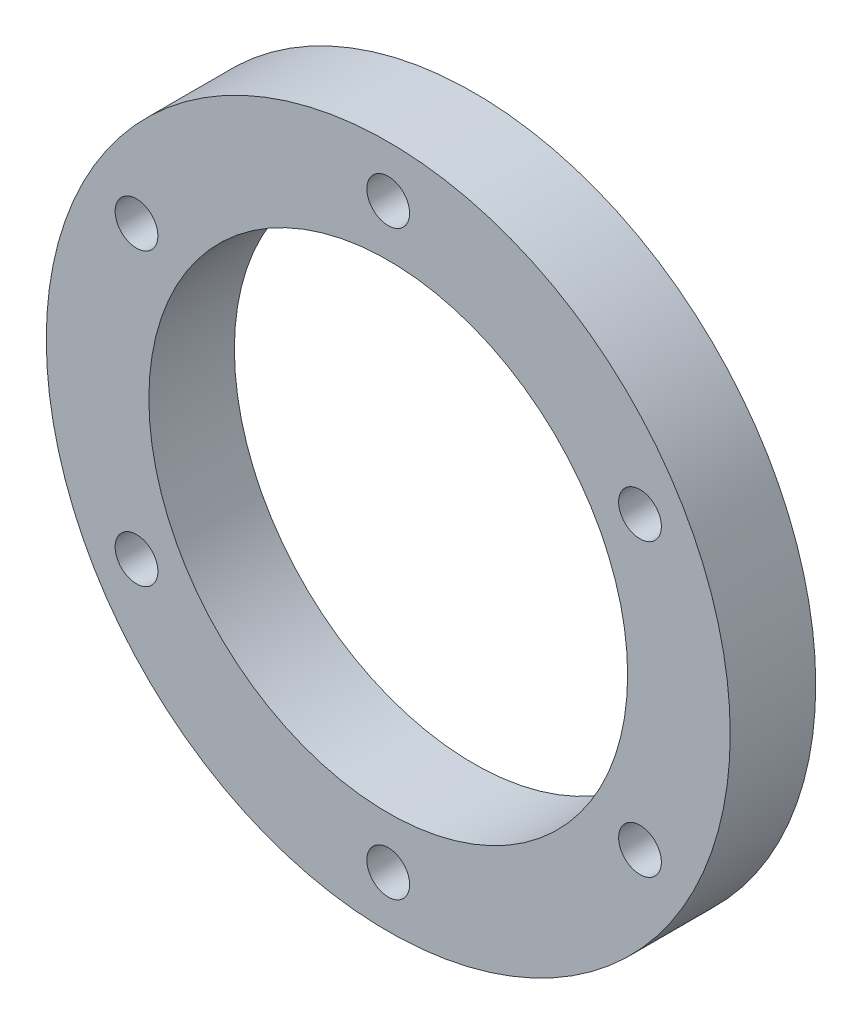
ISO-10303-21;
HEADER;
FILE_DESCRIPTION(('STEP AP214'),'2;1');
FILE_NAME('part.step','',(''),(''),'','','');
FILE_SCHEMA(('AUTOMOTIVE_DESIGN { 1 0 10303 214 1 1 1 1 }'));
ENDSEC;
DATA;
#1=APPLICATION_CONTEXT('core data for automotive mechanical design processes');
#2=APPLICATION_PROTOCOL_DEFINITION('international standard','automotive_design',2000,#1);
#3=PRODUCT_CONTEXT('',#1,'mechanical');
#4=PRODUCT('Part','Part','',(#3));
#5=PRODUCT_RELATED_PRODUCT_CATEGORY('part','',(#4));
#6=PRODUCT_DEFINITION_FORMATION('','',#4);
#7=PRODUCT_DEFINITION_CONTEXT('part definition',#1,'design');
#8=PRODUCT_DEFINITION('design','',#6,#7);
#9=PRODUCT_DEFINITION_SHAPE('','',#8);
#10=(LENGTH_UNIT() NAMED_UNIT(*) SI_UNIT(.MILLI.,.METRE.));
#11=(NAMED_UNIT(*) PLANE_ANGLE_UNIT() SI_UNIT($,.RADIAN.));
#12=(NAMED_UNIT(*) SI_UNIT($,.STERADIAN.) SOLID_ANGLE_UNIT());
#13=UNCERTAINTY_MEASURE_WITH_UNIT(LENGTH_MEASURE(1.E-05),#10,'distance_accuracy_value','');
#14=(GEOMETRIC_REPRESENTATION_CONTEXT(3) GLOBAL_UNCERTAINTY_ASSIGNED_CONTEXT((#13)) GLOBAL_UNIT_ASSIGNED_CONTEXT((#10,
#11,#12)) REPRESENTATION_CONTEXT('',''));
#15=CARTESIAN_POINT('',(0.,0.,0.));
#16=DIRECTION('',(0.,0.,1.));
#17=DIRECTION('',(1.,0.,0.));
#18=AXIS2_PLACEMENT_3D('',#15,#16,#17);
#19=CARTESIAN_POINT('',(0.,0.,5.));
#20=DIRECTION('',(0.,0.,1.));
#21=DIRECTION('',(1.,0.,0.));
#22=AXIS2_PLACEMENT_3D('',#19,#20,#21);
#23=PLANE('',#22);
#24=CARTESIAN_POINT('',(-14.7224318643344,-8.50000000000063,5.));
#25=DIRECTION('',(0.,0.,1.));
#26=DIRECTION('',(1.,0.,0.));
#27=AXIS2_PLACEMENT_3D('',#24,#25,#26);
#28=CIRCLE('',#27,1.25000000000138);
#29=CARTESIAN_POINT('',(-13.472431864333,-8.50000000000063,5.));
#30=VERTEX_POINT('',#29);
#31=EDGE_CURVE('E71',#30,#30,#28,.T.);
#32=ORIENTED_EDGE('',*,*,#31,.F.);
#33=EDGE_LOOP('',(#32));
#34=FACE_BOUND('',#33,.T.);
#35=CARTESIAN_POINT('',(14.7224318643365,-8.49999999999937,5.));
#36=DIRECTION('',(0.,0.,1.));
#37=DIRECTION('',(1.,0.,0.));
#38=AXIS2_PLACEMENT_3D('',#35,#36,#37);
#39=CIRCLE('',#38,1.25000000000093);
#40=CARTESIAN_POINT('',(15.9724318643375,-8.49999999999937,5.));
#41=VERTEX_POINT('',#40);
#42=EDGE_CURVE('E59',#41,#41,#39,.T.);
#43=ORIENTED_EDGE('',*,*,#42,.F.);
#44=EDGE_LOOP('',(#43));
#45=FACE_BOUND('',#44,.T.);
#46=CARTESIAN_POINT('',(0.,0.,5.));
#47=DIRECTION('',(0.,0.,1.));
#48=DIRECTION('',(1.,0.,0.));
#49=AXIS2_PLACEMENT_3D('',#46,#47,#48);
#50=CIRCLE('',#49,14.);
#51=CARTESIAN_POINT('',(14.,0.,5.));
#52=VERTEX_POINT('',#51);
#53=EDGE_CURVE('E47',#52,#52,#50,.T.);
#54=ORIENTED_EDGE('',*,*,#53,.F.);
#55=EDGE_LOOP('',(#54));
#56=FACE_BOUND('',#55,.T.);
#57=CARTESIAN_POINT('',(0.,0.,5.));
#58=DIRECTION('',(0.,0.,1.));
#59=DIRECTION('',(1.,0.,0.));
#60=AXIS2_PLACEMENT_3D('',#57,#58,#59);
#61=CIRCLE('',#60,20.);
#62=CARTESIAN_POINT('',(20.,0.,5.));
#63=VERTEX_POINT('',#62);
#64=EDGE_CURVE('E10',#63,#63,#61,.T.);
#65=ORIENTED_EDGE('',*,*,#64,.T.);
#66=EDGE_LOOP('',(#65));
#67=FACE_BOUND('',#66,.T.);
#68=CARTESIAN_POINT('',(0.,17.,5.));
#69=DIRECTION('',(0.,0.,1.));
#70=DIRECTION('',(1.,0.,0.));
#71=AXIS2_PLACEMENT_3D('',#68,#69,#70);
#72=CIRCLE('',#71,1.25);
#73=CARTESIAN_POINT('',(1.25,17.,5.));
#74=VERTEX_POINT('',#73);
#75=EDGE_CURVE('E42',#74,#74,#72,.T.);
#76=ORIENTED_EDGE('',*,*,#75,.F.);
#77=EDGE_LOOP('',(#76));
#78=FACE_BOUND('',#77,.T.);
#79=CARTESIAN_POINT('',(14.7224318643358,8.50000000000063,5.));
#80=DIRECTION('',(0.,0.,1.));
#81=DIRECTION('',(1.,0.,0.));
#82=AXIS2_PLACEMENT_3D('',#79,#80,#81);
#83=CIRCLE('',#82,1.25000000000021);
#84=CARTESIAN_POINT('',(15.972431864336,8.50000000000063,5.));
#85=VERTEX_POINT('',#84);
#86=EDGE_CURVE('E53',#85,#85,#83,.T.);
#87=ORIENTED_EDGE('',*,*,#86,.F.);
#88=EDGE_LOOP('',(#87));
#89=FACE_BOUND('',#88,.T.);
#90=CARTESIAN_POINT('',(1.4453433818335E-12,-17.,5.));
#91=DIRECTION('',(0.,0.,1.));
#92=DIRECTION('',(1.,0.,0.));
#93=AXIS2_PLACEMENT_3D('',#90,#91,#92);
#94=CIRCLE('',#93,1.2500000000015);
#95=CARTESIAN_POINT('',(1.25000000000294,-17.,5.));
#96=VERTEX_POINT('',#95);
#97=EDGE_CURVE('E65',#96,#96,#94,.T.);
#98=ORIENTED_EDGE('',*,*,#97,.F.);
#99=EDGE_LOOP('',(#98));
#100=FACE_BOUND('',#99,.T.);
#101=CARTESIAN_POINT('',(-14.7224318643351,8.49999999999936,5.));
#102=DIRECTION('',(0.,0.,1.));
#103=DIRECTION('',(1.,0.,0.));
#104=AXIS2_PLACEMENT_3D('',#101,#102,#103);
#105=CIRCLE('',#104,1.25000000000073);
#106=CARTESIAN_POINT('',(-13.4724318643344,8.49999999999936,5.));
#107=VERTEX_POINT('',#106);
#108=EDGE_CURVE('E77',#107,#107,#105,.T.);
#109=ORIENTED_EDGE('',*,*,#108,.F.);
#110=EDGE_LOOP('',(#109));
#111=FACE_BOUND('',#110,.T.);
#112=ADVANCED_FACE('F31',(#34,#45,#56,#67,#78,#89,#100,#111),#23,.T.);
#113=CARTESIAN_POINT('',(0.,0.,0.));
#114=DIRECTION('',(0.,0.,1.));
#115=DIRECTION('',(1.,0.,0.));
#116=AXIS2_PLACEMENT_3D('',#113,#114,#115);
#117=PLANE('',#116);
#118=CARTESIAN_POINT('',(0.,0.,0.));
#119=DIRECTION('',(0.,0.,1.));
#120=DIRECTION('',(1.,0.,0.));
#121=AXIS2_PLACEMENT_3D('',#118,#119,#120);
#122=CIRCLE('',#121,20.);
#123=CARTESIAN_POINT('',(20.,0.,0.));
#124=VERTEX_POINT('',#123);
#125=EDGE_CURVE('E35',#124,#124,#122,.T.);
#126=ORIENTED_EDGE('',*,*,#125,.F.);
#127=EDGE_LOOP('',(#126));
#128=FACE_BOUND('',#127,.T.);
#129=CARTESIAN_POINT('',(0.,17.,0.));
#130=DIRECTION('',(0.,0.,1.));
#131=DIRECTION('',(1.,0.,0.));
#132=AXIS2_PLACEMENT_3D('',#129,#130,#131);
#133=CIRCLE('',#132,1.25);
#134=CARTESIAN_POINT('',(1.25,17.,0.));
#135=VERTEX_POINT('',#134);
#136=EDGE_CURVE('E44',#135,#135,#133,.T.);
#137=ORIENTED_EDGE('',*,*,#136,.T.);
#138=EDGE_LOOP('',(#137));
#139=FACE_BOUND('',#138,.T.);
#140=CARTESIAN_POINT('',(0.,0.,0.));
#141=DIRECTION('',(0.,0.,1.));
#142=DIRECTION('',(1.,0.,0.));
#143=AXIS2_PLACEMENT_3D('',#140,#141,#142);
#144=CIRCLE('',#143,14.);
#145=CARTESIAN_POINT('',(14.,0.,0.));
#146=VERTEX_POINT('',#145);
#147=EDGE_CURVE('E50',#146,#146,#144,.T.);
#148=ORIENTED_EDGE('',*,*,#147,.T.);
#149=EDGE_LOOP('',(#148));
#150=FACE_BOUND('',#149,.T.);
#151=CARTESIAN_POINT('',(14.7224318643358,8.50000000000063,0.));
#152=DIRECTION('',(0.,0.,1.));
#153=DIRECTION('',(1.,0.,0.));
#154=AXIS2_PLACEMENT_3D('',#151,#152,#153);
#155=CIRCLE('',#154,1.25000000000021);
#156=CARTESIAN_POINT('',(15.972431864336,8.50000000000063,0.));
#157=VERTEX_POINT('',#156);
#158=EDGE_CURVE('E56',#157,#157,#155,.T.);
#159=ORIENTED_EDGE('',*,*,#158,.T.);
#160=EDGE_LOOP('',(#159));
#161=FACE_BOUND('',#160,.T.);
#162=CARTESIAN_POINT('',(14.7224318643365,-8.49999999999937,0.));
#163=DIRECTION('',(0.,0.,1.));
#164=DIRECTION('',(1.,0.,0.));
#165=AXIS2_PLACEMENT_3D('',#162,#163,#164);
#166=CIRCLE('',#165,1.25000000000093);
#167=CARTESIAN_POINT('',(15.9724318643375,-8.49999999999937,0.));
#168=VERTEX_POINT('',#167);
#169=EDGE_CURVE('E62',#168,#168,#166,.T.);
#170=ORIENTED_EDGE('',*,*,#169,.T.);
#171=EDGE_LOOP('',(#170));
#172=FACE_BOUND('',#171,.T.);
#173=CARTESIAN_POINT('',(1.4453433818335E-12,-17.,0.));
#174=DIRECTION('',(0.,0.,1.));
#175=DIRECTION('',(1.,0.,0.));
#176=AXIS2_PLACEMENT_3D('',#173,#174,#175);
#177=CIRCLE('',#176,1.2500000000015);
#178=CARTESIAN_POINT('',(1.25000000000294,-17.,0.));
#179=VERTEX_POINT('',#178);
#180=EDGE_CURVE('E68',#179,#179,#177,.T.);
#181=ORIENTED_EDGE('',*,*,#180,.T.);
#182=EDGE_LOOP('',(#181));
#183=FACE_BOUND('',#182,.T.);
#184=CARTESIAN_POINT('',(-14.7224318643344,-8.50000000000063,0.));
#185=DIRECTION('',(0.,0.,1.));
#186=DIRECTION('',(1.,0.,0.));
#187=AXIS2_PLACEMENT_3D('',#184,#185,#186);
#188=CIRCLE('',#187,1.25000000000138);
#189=CARTESIAN_POINT('',(-13.472431864333,-8.50000000000063,0.));
#190=VERTEX_POINT('',#189);
#191=EDGE_CURVE('E74',#190,#190,#188,.T.);
#192=ORIENTED_EDGE('',*,*,#191,.T.);
#193=EDGE_LOOP('',(#192));
#194=FACE_BOUND('',#193,.T.);
#195=CARTESIAN_POINT('',(-14.7224318643351,8.49999999999936,0.));
#196=DIRECTION('',(0.,0.,1.));
#197=DIRECTION('',(1.,0.,0.));
#198=AXIS2_PLACEMENT_3D('',#195,#196,#197);
#199=CIRCLE('',#198,1.25000000000073);
#200=CARTESIAN_POINT('',(-13.4724318643344,8.49999999999936,0.));
#201=VERTEX_POINT('',#200);
#202=EDGE_CURVE('E80',#201,#201,#199,.T.);
#203=ORIENTED_EDGE('',*,*,#202,.T.);
#204=EDGE_LOOP('',(#203));
#205=FACE_BOUND('',#204,.T.);
#206=ADVANCED_FACE('F90',(#128,#139,#150,#161,#172,#183,#194,#205),#117,.F.);
#207=CARTESIAN_POINT('',(0.,0.,5.));
#208=DIRECTION('',(0.,0.,-1.));
#209=DIRECTION('',(-1.,0.,0.));
#210=AXIS2_PLACEMENT_3D('',#207,#208,#209);
#211=CYLINDRICAL_SURFACE('',#210,20.);
#212=ORIENTED_EDGE('',*,*,#64,.F.);
#213=EDGE_LOOP('',(#212));
#214=FACE_BOUND('',#213,.T.);
#215=ORIENTED_EDGE('',*,*,#125,.T.);
#216=EDGE_LOOP('',(#215));
#217=FACE_BOUND('',#216,.T.);
#218=ADVANCED_FACE('F33',(#214,#217),#211,.T.);
#219=CARTESIAN_POINT('',(0.,17.,5.));
#220=DIRECTION('',(0.,0.,-1.));
#221=DIRECTION('',(-1.,0.,0.));
#222=AXIS2_PLACEMENT_3D('',#219,#220,#221);
#223=CYLINDRICAL_SURFACE('',#222,1.25);
#224=ORIENTED_EDGE('',*,*,#75,.T.);
#225=EDGE_LOOP('',(#224));
#226=FACE_BOUND('',#225,.T.);
#227=ORIENTED_EDGE('',*,*,#136,.F.);
#228=EDGE_LOOP('',(#227));
#229=FACE_BOUND('',#228,.T.);
#230=ADVANCED_FACE('F100',(#226,#229),#223,.F.);
#231=CARTESIAN_POINT('',(0.,0.,5.));
#232=DIRECTION('',(0.,0.,-1.));
#233=DIRECTION('',(-1.,0.,0.));
#234=AXIS2_PLACEMENT_3D('',#231,#232,#233);
#235=CYLINDRICAL_SURFACE('',#234,14.);
#236=ORIENTED_EDGE('',*,*,#53,.T.);
#237=EDGE_LOOP('',(#236));
#238=FACE_BOUND('',#237,.T.);
#239=ORIENTED_EDGE('',*,*,#147,.F.);
#240=EDGE_LOOP('',(#239));
#241=FACE_BOUND('',#240,.T.);
#242=ADVANCED_FACE('F103',(#238,#241),#235,.F.);
#243=CARTESIAN_POINT('',(14.7224318643358,8.50000000000063,5.));
#244=DIRECTION('',(0.,0.,-1.));
#245=DIRECTION('',(-1.,0.,0.));
#246=AXIS2_PLACEMENT_3D('',#243,#244,#245);
#247=CYLINDRICAL_SURFACE('',#246,1.25000000000021);
#248=ORIENTED_EDGE('',*,*,#86,.T.);
#249=EDGE_LOOP('',(#248));
#250=FACE_BOUND('',#249,.T.);
#251=ORIENTED_EDGE('',*,*,#158,.F.);
#252=EDGE_LOOP('',(#251));
#253=FACE_BOUND('',#252,.T.);
#254=ADVANCED_FACE('F107',(#250,#253),#247,.F.);
#255=CARTESIAN_POINT('',(14.7224318643365,-8.49999999999937,5.));
#256=DIRECTION('',(0.,0.,-1.));
#257=DIRECTION('',(-1.,0.,0.));
#258=AXIS2_PLACEMENT_3D('',#255,#256,#257);
#259=CYLINDRICAL_SURFACE('',#258,1.25000000000093);
#260=ORIENTED_EDGE('',*,*,#42,.T.);
#261=EDGE_LOOP('',(#260));
#262=FACE_BOUND('',#261,.T.);
#263=ORIENTED_EDGE('',*,*,#169,.F.);
#264=EDGE_LOOP('',(#263));
#265=FACE_BOUND('',#264,.T.);
#266=ADVANCED_FACE('F111',(#262,#265),#259,.F.);
#267=CARTESIAN_POINT('',(1.4453433818335E-12,-17.,5.));
#268=DIRECTION('',(0.,0.,-1.));
#269=DIRECTION('',(-1.,0.,0.));
#270=AXIS2_PLACEMENT_3D('',#267,#268,#269);
#271=CYLINDRICAL_SURFACE('',#270,1.2500000000015);
#272=ORIENTED_EDGE('',*,*,#97,.T.);
#273=EDGE_LOOP('',(#272));
#274=FACE_BOUND('',#273,.T.);
#275=ORIENTED_EDGE('',*,*,#180,.F.);
#276=EDGE_LOOP('',(#275));
#277=FACE_BOUND('',#276,.T.);
#278=ADVANCED_FACE('F115',(#274,#277),#271,.F.);
#279=CARTESIAN_POINT('',(-14.7224318643344,-8.50000000000063,5.));
#280=DIRECTION('',(0.,0.,-1.));
#281=DIRECTION('',(-1.,0.,0.));
#282=AXIS2_PLACEMENT_3D('',#279,#280,#281);
#283=CYLINDRICAL_SURFACE('',#282,1.25000000000138);
#284=ORIENTED_EDGE('',*,*,#31,.T.);
#285=EDGE_LOOP('',(#284));
#286=FACE_BOUND('',#285,.T.);
#287=ORIENTED_EDGE('',*,*,#191,.F.);
#288=EDGE_LOOP('',(#287));
#289=FACE_BOUND('',#288,.T.);
#290=ADVANCED_FACE('F119',(#286,#289),#283,.F.);
#291=CARTESIAN_POINT('',(-14.7224318643351,8.49999999999936,5.));
#292=DIRECTION('',(0.,0.,-1.));
#293=DIRECTION('',(-1.,0.,0.));
#294=AXIS2_PLACEMENT_3D('',#291,#292,#293);
#295=CYLINDRICAL_SURFACE('',#294,1.25000000000073);
#296=ORIENTED_EDGE('',*,*,#108,.T.);
#297=EDGE_LOOP('',(#296));
#298=FACE_BOUND('',#297,.T.);
#299=ORIENTED_EDGE('',*,*,#202,.F.);
#300=EDGE_LOOP('',(#299));
#301=FACE_BOUND('',#300,.T.);
#302=ADVANCED_FACE('F86',(#298,#301),#295,.F.);
#303=CLOSED_SHELL('',(#112,#206,#218,#230,#242,#254,#266,#278,#290,#302));
#304=MANIFOLD_SOLID_BREP('B2',#303);
#305=ADVANCED_BREP_SHAPE_REPRESENTATION('',(#18,#304),#14);
#306=SHAPE_DEFINITION_REPRESENTATION(#9,#305);
ENDSEC;
END-ISO-10303-21;
